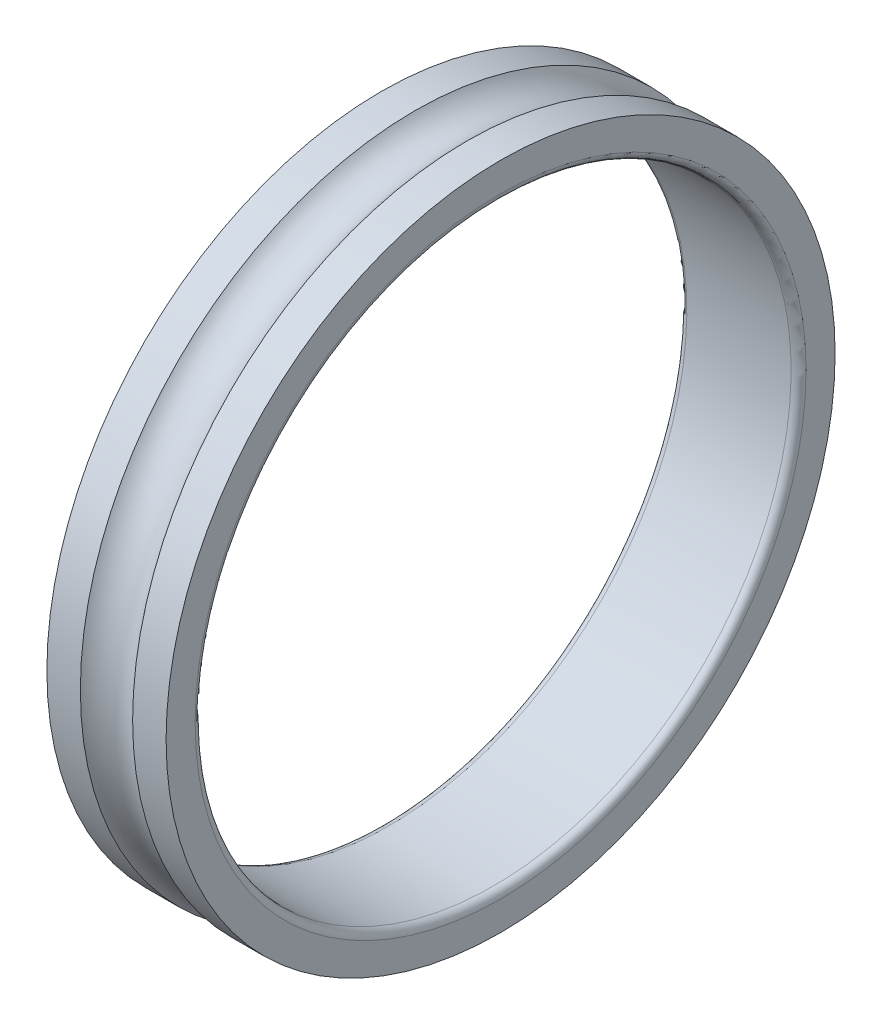
ISO-10303-21;
HEADER;
FILE_DESCRIPTION(('STEP AP214'),'2;1');
FILE_NAME('part.step','',(''),(''),'','','');
FILE_SCHEMA(('AUTOMOTIVE_DESIGN { 1 0 10303 214 1 1 1 1 }'));
ENDSEC;
DATA;
#1=APPLICATION_CONTEXT('core data for automotive mechanical design processes');
#2=APPLICATION_PROTOCOL_DEFINITION('international standard','automotive_design',2000,#1);
#3=PRODUCT_CONTEXT('',#1,'mechanical');
#4=PRODUCT('Part','Part','',(#3));
#5=PRODUCT_RELATED_PRODUCT_CATEGORY('part','',(#4));
#6=PRODUCT_DEFINITION_FORMATION('','',#4);
#7=PRODUCT_DEFINITION_CONTEXT('part definition',#1,'design');
#8=PRODUCT_DEFINITION('design','',#6,#7);
#9=PRODUCT_DEFINITION_SHAPE('','',#8);
#10=(LENGTH_UNIT() NAMED_UNIT(*) SI_UNIT(.MILLI.,.METRE.));
#11=(NAMED_UNIT(*) PLANE_ANGLE_UNIT() SI_UNIT($,.RADIAN.));
#12=(NAMED_UNIT(*) SI_UNIT($,.STERADIAN.) SOLID_ANGLE_UNIT());
#13=UNCERTAINTY_MEASURE_WITH_UNIT(LENGTH_MEASURE(1.E-05),#10,'distance_accuracy_value','');
#14=(GEOMETRIC_REPRESENTATION_CONTEXT(3) GLOBAL_UNCERTAINTY_ASSIGNED_CONTEXT((#13)) GLOBAL_UNIT_ASSIGNED_CONTEXT((#10,
#11,#12)) REPRESENTATION_CONTEXT('',''));
#15=CARTESIAN_POINT('',(0.,0.,0.));
#16=DIRECTION('',(0.,0.,1.));
#17=DIRECTION('',(1.,0.,0.));
#18=AXIS2_PLACEMENT_3D('',#15,#16,#17);
#19=CARTESIAN_POINT('',(13.7533960084647,0.,0.));
#20=DIRECTION('',(-1.,0.,0.));
#21=DIRECTION('',(0.,1.,0.));
#22=AXIS2_PLACEMENT_3D('',#19,#20,#21);
#23=CYLINDRICAL_SURFACE('',#22,44.9);
#24=CARTESIAN_POINT('',(11.5067920169294,0.,0.));
#25=DIRECTION('',(1.,0.,0.));
#26=DIRECTION('',(0.,1.,0.));
#27=AXIS2_PLACEMENT_3D('',#24,#25,#26);
#28=CIRCLE('',#27,44.9);
#29=CARTESIAN_POINT('',(11.5067920169294,44.9,0.));
#30=VERTEX_POINT('',#29);
#31=EDGE_CURVE('E11',#30,#30,#28,.T.);
#32=ORIENTED_EDGE('',*,*,#31,.T.);
#33=EDGE_LOOP('',(#32));
#34=FACE_BOUND('',#33,.T.);
#35=CARTESIAN_POINT('',(16.,0.,0.));
#36=DIRECTION('',(1.,0.,0.));
#37=DIRECTION('',(0.,1.,0.));
#38=AXIS2_PLACEMENT_3D('',#35,#36,#37);
#39=CIRCLE('',#38,44.9);
#40=CARTESIAN_POINT('',(16.,44.9,0.));
#41=VERTEX_POINT('',#40);
#42=EDGE_CURVE('E73',#41,#41,#39,.T.);
#43=ORIENTED_EDGE('',*,*,#42,.F.);
#44=EDGE_LOOP('',(#43));
#45=FACE_BOUND('',#44,.T.);
#46=ADVANCED_FACE('F17',(#34,#45),#23,.T.);
#47=CARTESIAN_POINT('',(8.,0.,0.));
#48=DIRECTION('',(1.,0.,0.));
#49=DIRECTION('',(0.,0.,-1.));
#50=AXIS2_PLACEMENT_3D('',#47,#48,#49);
#51=TOROIDAL_SURFACE('',#50,47.5,4.3655);
#52=CARTESIAN_POINT('',(4.49320798307056,0.,0.));
#53=DIRECTION('',(1.,0.,0.));
#54=DIRECTION('',(0.,1.,0.));
#55=AXIS2_PLACEMENT_3D('',#52,#53,#54);
#56=CIRCLE('',#55,44.9);
#57=CARTESIAN_POINT('',(4.49320798307056,44.9,0.));
#58=VERTEX_POINT('',#57);
#59=EDGE_CURVE('E28',#58,#58,#56,.T.);
#60=ORIENTED_EDGE('',*,*,#59,.T.);
#61=EDGE_LOOP('',(#60));
#62=FACE_BOUND('',#61,.T.);
#63=ORIENTED_EDGE('',*,*,#31,.F.);
#64=EDGE_LOOP('',(#63));
#65=FACE_BOUND('',#64,.T.);
#66=ADVANCED_FACE('F95',(#62,#65),#51,.F.);
#67=CARTESIAN_POINT('',(2.24660399153528,0.,0.));
#68=DIRECTION('',(-1.,0.,0.));
#69=DIRECTION('',(0.,1.,0.));
#70=AXIS2_PLACEMENT_3D('',#67,#68,#69);
#71=CYLINDRICAL_SURFACE('',#70,44.9);
#72=CARTESIAN_POINT('',(0.,0.,0.));
#73=DIRECTION('',(1.,0.,0.));
#74=DIRECTION('',(0.,1.,0.));
#75=AXIS2_PLACEMENT_3D('',#72,#73,#74);
#76=CIRCLE('',#75,44.9);
#77=CARTESIAN_POINT('',(0.,44.9,0.));
#78=VERTEX_POINT('',#77);
#79=EDGE_CURVE('E62',#78,#78,#76,.T.);
#80=ORIENTED_EDGE('',*,*,#79,.T.);
#81=EDGE_LOOP('',(#80));
#82=FACE_BOUND('',#81,.T.);
#83=ORIENTED_EDGE('',*,*,#59,.F.);
#84=EDGE_LOOP('',(#83));
#85=FACE_BOUND('',#84,.T.);
#86=ADVANCED_FACE('F99',(#82,#85),#71,.T.);
#87=CARTESIAN_POINT('',(0.,42.95,0.));
#88=DIRECTION('',(-1.,0.,0.));
#89=DIRECTION('',(0.,-1.,0.));
#90=AXIS2_PLACEMENT_3D('',#87,#88,#89);
#91=PLANE('',#90);
#92=CARTESIAN_POINT('',(0.,0.,0.));
#93=DIRECTION('',(1.,0.,0.));
#94=DIRECTION('',(0.,1.,0.));
#95=AXIS2_PLACEMENT_3D('',#92,#93,#94);
#96=CIRCLE('',#95,41.);
#97=CARTESIAN_POINT('',(0.,41.,0.));
#98=VERTEX_POINT('',#97);
#99=EDGE_CURVE('E57',#98,#98,#96,.T.);
#100=ORIENTED_EDGE('',*,*,#99,.T.);
#101=EDGE_LOOP('',(#100));
#102=FACE_BOUND('',#101,.T.);
#103=ORIENTED_EDGE('',*,*,#79,.F.);
#104=EDGE_LOOP('',(#103));
#105=FACE_BOUND('',#104,.T.);
#106=ADVANCED_FACE('F58',(#102,#105),#91,.T.);
#107=CARTESIAN_POINT('',(1.,0.,0.));
#108=DIRECTION('',(1.,0.,0.));
#109=DIRECTION('',(0.,0.,-1.));
#110=AXIS2_PLACEMENT_3D('',#107,#108,#109);
#111=TOROIDAL_SURFACE('',#110,41.,1.);
#112=CARTESIAN_POINT('',(1.,0.,0.));
#113=DIRECTION('',(1.,0.,0.));
#114=DIRECTION('',(0.,1.,0.));
#115=AXIS2_PLACEMENT_3D('',#112,#113,#114);
#116=CIRCLE('',#115,40.);
#117=CARTESIAN_POINT('',(1.,40.,0.));
#118=VERTEX_POINT('',#117);
#119=EDGE_CURVE('E53',#118,#118,#116,.T.);
#120=ORIENTED_EDGE('',*,*,#119,.T.);
#121=EDGE_LOOP('',(#120));
#122=FACE_BOUND('',#121,.T.);
#123=ORIENTED_EDGE('',*,*,#99,.F.);
#124=EDGE_LOOP('',(#123));
#125=FACE_BOUND('',#124,.T.);
#126=ADVANCED_FACE('F107',(#122,#125),#111,.T.);
#127=CARTESIAN_POINT('',(8.,0.,0.));
#128=DIRECTION('',(-1.,0.,0.));
#129=DIRECTION('',(0.,1.,0.));
#130=AXIS2_PLACEMENT_3D('',#127,#128,#129);
#131=CYLINDRICAL_SURFACE('',#130,40.);
#132=CARTESIAN_POINT('',(15.,0.,0.));
#133=DIRECTION('',(1.,0.,0.));
#134=DIRECTION('',(0.,1.,0.));
#135=AXIS2_PLACEMENT_3D('',#132,#133,#134);
#136=CIRCLE('',#135,40.);
#137=CARTESIAN_POINT('',(15.,40.,0.));
#138=VERTEX_POINT('',#137);
#139=EDGE_CURVE('E21',#138,#138,#136,.T.);
#140=ORIENTED_EDGE('',*,*,#139,.T.);
#141=EDGE_LOOP('',(#140));
#142=FACE_BOUND('',#141,.T.);
#143=ORIENTED_EDGE('',*,*,#119,.F.);
#144=EDGE_LOOP('',(#143));
#145=FACE_BOUND('',#144,.T.);
#146=ADVANCED_FACE('F91',(#142,#145),#131,.F.);
#147=CARTESIAN_POINT('',(15.,0.,0.));
#148=DIRECTION('',(1.,0.,0.));
#149=DIRECTION('',(0.,0.,-1.));
#150=AXIS2_PLACEMENT_3D('',#147,#148,#149);
#151=TOROIDAL_SURFACE('',#150,41.,1.);
#152=CARTESIAN_POINT('',(16.,0.,0.));
#153=DIRECTION('',(1.,0.,0.));
#154=DIRECTION('',(0.,1.,0.));
#155=AXIS2_PLACEMENT_3D('',#152,#153,#154);
#156=CIRCLE('',#155,41.);
#157=CARTESIAN_POINT('',(16.,41.,0.));
#158=VERTEX_POINT('',#157);
#159=EDGE_CURVE('E76',#158,#158,#156,.T.);
#160=ORIENTED_EDGE('',*,*,#159,.T.);
#161=EDGE_LOOP('',(#160));
#162=FACE_BOUND('',#161,.T.);
#163=ORIENTED_EDGE('',*,*,#139,.F.);
#164=EDGE_LOOP('',(#163));
#165=FACE_BOUND('',#164,.T.);
#166=ADVANCED_FACE('F19',(#162,#165),#151,.T.);
#167=CARTESIAN_POINT('',(16.,42.95,0.));
#168=DIRECTION('',(1.,0.,0.));
#169=DIRECTION('',(0.,1.,0.));
#170=AXIS2_PLACEMENT_3D('',#167,#168,#169);
#171=PLANE('',#170);
#172=ORIENTED_EDGE('',*,*,#42,.T.);
#173=EDGE_LOOP('',(#172));
#174=FACE_BOUND('',#173,.T.);
#175=ORIENTED_EDGE('',*,*,#159,.F.);
#176=EDGE_LOOP('',(#175));
#177=FACE_BOUND('',#176,.T.);
#178=ADVANCED_FACE('F83',(#174,#177),#171,.T.);
#179=CLOSED_SHELL('',(#46,#66,#86,#106,#126,#146,#166,#178));
#180=MANIFOLD_SOLID_BREP('B1',#179);
#181=ADVANCED_BREP_SHAPE_REPRESENTATION('',(#18,#180),#14);
#182=SHAPE_DEFINITION_REPRESENTATION(#9,#181);
ENDSEC;
END-ISO-10303-21;
